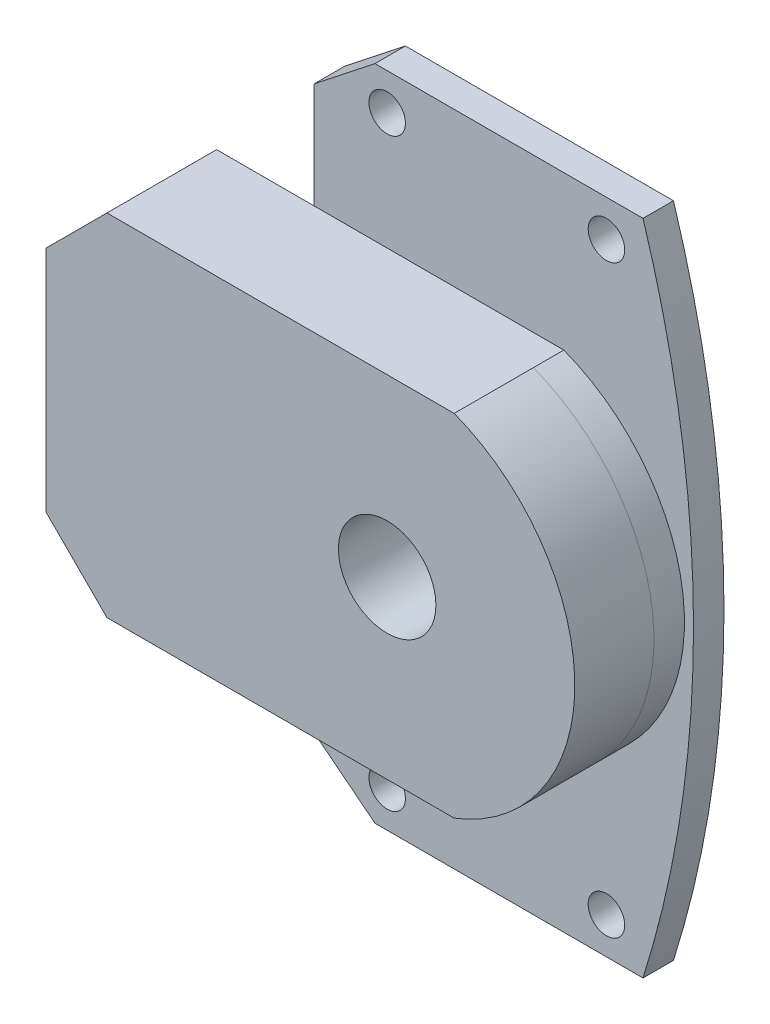
ISO-10303-21;
HEADER;
FILE_DESCRIPTION(('STEP AP214'),'2;1');
FILE_NAME('part.step','',(''),(''),'','','');
FILE_SCHEMA(('AUTOMOTIVE_DESIGN { 1 0 10303 214 1 1 1 1 }'));
ENDSEC;
DATA;
#1=APPLICATION_CONTEXT('core data for automotive mechanical design processes');
#2=APPLICATION_PROTOCOL_DEFINITION('international standard','automotive_design',2000,#1);
#3=PRODUCT_CONTEXT('',#1,'mechanical');
#4=PRODUCT('Part','Part','',(#3));
#5=PRODUCT_RELATED_PRODUCT_CATEGORY('part','',(#4));
#6=PRODUCT_DEFINITION_FORMATION('','',#4);
#7=PRODUCT_DEFINITION_CONTEXT('part definition',#1,'design');
#8=PRODUCT_DEFINITION('design','',#6,#7);
#9=PRODUCT_DEFINITION_SHAPE('','',#8);
#10=(LENGTH_UNIT() NAMED_UNIT(*) SI_UNIT(.MILLI.,.METRE.));
#11=(NAMED_UNIT(*) PLANE_ANGLE_UNIT() SI_UNIT($,.RADIAN.));
#12=(NAMED_UNIT(*) SI_UNIT($,.STERADIAN.) SOLID_ANGLE_UNIT());
#13=UNCERTAINTY_MEASURE_WITH_UNIT(LENGTH_MEASURE(1.E-05),#10,'distance_accuracy_value','');
#14=(GEOMETRIC_REPRESENTATION_CONTEXT(3) GLOBAL_UNCERTAINTY_ASSIGNED_CONTEXT((#13)) GLOBAL_UNIT_ASSIGNED_CONTEXT((#10,
#11,#12)) REPRESENTATION_CONTEXT('',''));
#15=CARTESIAN_POINT('',(0.,0.,0.));
#16=DIRECTION('',(0.,0.,1.));
#17=DIRECTION('',(1.,0.,0.));
#18=AXIS2_PLACEMENT_3D('',#15,#16,#17);
#19=CARTESIAN_POINT('',(-87.5169435511757,-10.5980462863294,-2.5));
#20=DIRECTION('',(0.,0.,-1.));
#21=DIRECTION('',(-1.,0.,0.));
#22=AXIS2_PLACEMENT_3D('',#19,#20,#21);
#23=PLANE('',#22);
#24=CARTESIAN_POINT('',(-4.66241542365062,-34.5980462863294,-2.5));
#25=DIRECTION('',(0.,0.,-1.));
#26=DIRECTION('',(1.,0.,0.));
#27=AXIS2_PLACEMENT_3D('',#24,#25,#26);
#28=CIRCLE('',#27,1.5);
#29=CARTESIAN_POINT('',(-3.16241542365062,-34.5980462863294,-2.5));
#30=VERTEX_POINT('',#29);
#31=EDGE_CURVE('E224',#30,#30,#28,.T.);
#32=ORIENTED_EDGE('',*,*,#31,.F.);
#33=EDGE_LOOP('',(#32));
#34=FACE_BOUND('',#33,.T.);
#35=CARTESIAN_POINT('',(-4.66241542365062,13.4019537136706,-2.5));
#36=DIRECTION('',(0.,0.,-1.));
#37=DIRECTION('',(-1.,0.,0.));
#38=AXIS2_PLACEMENT_3D('',#35,#36,#37);
#39=CIRCLE('',#38,1.5);
#40=CARTESIAN_POINT('',(-6.16241542365062,13.4019537136706,-2.5));
#41=VERTEX_POINT('',#40);
#42=EDGE_CURVE('E163',#41,#41,#39,.T.);
#43=ORIENTED_EDGE('',*,*,#42,.F.);
#44=EDGE_LOOP('',(#43));
#45=FACE_BOUND('',#44,.T.);
#46=DIRECTION('',(-0.785278343538107,0.619142893983325,0.));
#47=VECTOR('',#46,1.);
#48=CARTESIAN_POINT('',(-28.6624154236506,-33.6558587863294,-2.5));
#49=LINE('',#48,#47);
#50=CARTESIAN_POINT('',(-23.6624154236506,-37.5980462863294,-2.5));
#51=VERTEX_POINT('',#50);
#52=CARTESIAN_POINT('',(-28.6624154236506,-33.6558587863294,-2.5));
#53=VERTEX_POINT('',#52);
#54=EDGE_CURVE('E164',#51,#53,#49,.T.);
#55=ORIENTED_EDGE('',*,*,#54,.T.);
#56=DIRECTION('',(0.,1.,0.));
#57=VECTOR('',#56,1.);
#58=CARTESIAN_POINT('',(-28.6624154236506,12.4597662136706,-2.5));
#59=LINE('',#58,#57);
#60=CARTESIAN_POINT('',(-28.6624154236506,12.4597662136706,-2.5));
#61=VERTEX_POINT('',#60);
#62=EDGE_CURVE('E107',#53,#61,#59,.T.);
#63=ORIENTED_EDGE('',*,*,#62,.T.);
#64=DIRECTION('',(0.785278343538107,0.619142893983325,0.));
#65=VECTOR('',#64,1.);
#66=CARTESIAN_POINT('',(-23.6624154236506,16.4019537136706,-2.5));
#67=LINE('',#66,#65);
#68=CARTESIAN_POINT('',(-23.6624154236506,16.4019537136706,-2.5));
#69=VERTEX_POINT('',#68);
#70=EDGE_CURVE('E120',#61,#69,#67,.T.);
#71=ORIENTED_EDGE('',*,*,#70,.T.);
#72=DIRECTION('',(1.,0.,0.));
#73=VECTOR('',#72,1.);
#74=CARTESIAN_POINT('',(-23.6624154236506,16.4019537136706,-2.5));
#75=LINE('',#74,#73);
#76=CARTESIAN_POINT('',(-1.66241542365062,16.4019537136706,-2.5));
#77=VERTEX_POINT('',#76);
#78=EDGE_CURVE('E114',#69,#77,#75,.T.);
#79=ORIENTED_EDGE('',*,*,#78,.T.);
#80=CARTESIAN_POINT('',(-87.5169435511757,-10.5980462863294,-2.5));
#81=DIRECTION('',(0.,0.,-1.));
#82=DIRECTION('',(-1.,0.,0.));
#83=AXIS2_PLACEMENT_3D('',#80,#81,#82);
#84=CIRCLE('',#83,90.);
#85=CARTESIAN_POINT('',(-1.66241542365062,-37.5980462863294,-2.5));
#86=VERTEX_POINT('',#85);
#87=EDGE_CURVE('E118',#77,#86,#84,.T.);
#88=ORIENTED_EDGE('',*,*,#87,.T.);
#89=DIRECTION('',(-1.,0.,0.));
#90=VECTOR('',#89,1.);
#91=CARTESIAN_POINT('',(-23.6624154236506,-37.5980462863294,-2.5));
#92=LINE('',#91,#90);
#93=EDGE_CURVE('E70',#86,#51,#92,.T.);
#94=ORIENTED_EDGE('',*,*,#93,.T.);
#95=EDGE_LOOP('',(#55,#63,#71,#79,#88,#94));
#96=FACE_BOUND('',#95,.T.);
#97=CARTESIAN_POINT('',(-13.6624154236506,-10.5980462863294,-2.5));
#98=DIRECTION('',(0.,0.,-1.));
#99=DIRECTION('',(-1.,0.,0.));
#100=AXIS2_PLACEMENT_3D('',#97,#98,#99);
#101=CIRCLE('',#100,10.);
#102=CARTESIAN_POINT('',(-23.6624154236506,-10.5980462863294,-2.5));
#103=VERTEX_POINT('',#102);
#104=EDGE_CURVE('E151',#103,#103,#101,.T.);
#105=ORIENTED_EDGE('',*,*,#104,.F.);
#106=EDGE_LOOP('',(#105));
#107=FACE_BOUND('',#106,.T.);
#108=CARTESIAN_POINT('',(-22.6624154236506,13.4019537136706,-2.5));
#109=DIRECTION('',(0.,0.,-1.));
#110=DIRECTION('',(1.,0.,0.));
#111=AXIS2_PLACEMENT_3D('',#108,#109,#110);
#112=CIRCLE('',#111,1.5);
#113=CARTESIAN_POINT('',(-21.1624154236506,13.4019537136706,-2.5));
#114=VERTEX_POINT('',#113);
#115=EDGE_CURVE('E229',#114,#114,#112,.T.);
#116=ORIENTED_EDGE('',*,*,#115,.F.);
#117=EDGE_LOOP('',(#116));
#118=FACE_BOUND('',#117,.T.);
#119=CARTESIAN_POINT('',(-22.6624154236506,-34.5980462863294,-2.5));
#120=DIRECTION('',(0.,0.,-1.));
#121=DIRECTION('',(-1.,0.,0.));
#122=AXIS2_PLACEMENT_3D('',#119,#120,#121);
#123=CIRCLE('',#122,1.5);
#124=CARTESIAN_POINT('',(-24.1624154236506,-34.5980462863294,-2.5));
#125=VERTEX_POINT('',#124);
#126=EDGE_CURVE('E218',#125,#125,#123,.T.);
#127=ORIENTED_EDGE('',*,*,#126,.F.);
#128=EDGE_LOOP('',(#127));
#129=FACE_BOUND('',#128,.T.);
#130=ADVANCED_FACE('F53',(#34,#45,#96,#107,#118,#129),#23,.T.);
#131=CARTESIAN_POINT('',(-87.5169435511757,-10.5980462863294,0.));
#132=DIRECTION('',(0.,0.,-1.));
#133=DIRECTION('',(-1.,0.,0.));
#134=AXIS2_PLACEMENT_3D('',#131,#132,#133);
#135=PLANE('',#134);
#136=DIRECTION('',(-0.785278343538107,0.619142893983325,0.));
#137=VECTOR('',#136,1.);
#138=CARTESIAN_POINT('',(-28.6624154236506,-33.6558587863294,0.));
#139=LINE('',#138,#137);
#140=CARTESIAN_POINT('',(-23.6624154236506,-37.5980462863294,0.));
#141=VERTEX_POINT('',#140);
#142=CARTESIAN_POINT('',(-28.6624154236506,-33.6558587863294,0.));
#143=VERTEX_POINT('',#142);
#144=EDGE_CURVE('E157',#141,#143,#139,.T.);
#145=ORIENTED_EDGE('',*,*,#144,.F.);
#146=DIRECTION('',(-1.,0.,0.));
#147=VECTOR('',#146,1.);
#148=CARTESIAN_POINT('',(-23.6624154236506,-37.5980462863294,0.));
#149=LINE('',#148,#147);
#150=CARTESIAN_POINT('',(-1.66241542365062,-37.5980462863294,0.));
#151=VERTEX_POINT('',#150);
#152=EDGE_CURVE('E99',#151,#141,#149,.T.);
#153=ORIENTED_EDGE('',*,*,#152,.F.);
#154=CARTESIAN_POINT('',(-87.5169435511757,-10.5980462863294,0.));
#155=DIRECTION('',(0.,0.,-1.));
#156=DIRECTION('',(-1.,0.,0.));
#157=AXIS2_PLACEMENT_3D('',#154,#155,#156);
#158=CIRCLE('',#157,90.);
#159=CARTESIAN_POINT('',(-1.66241542365062,16.4019537136706,0.));
#160=VERTEX_POINT('',#159);
#161=EDGE_CURVE('E93',#160,#151,#158,.T.);
#162=ORIENTED_EDGE('',*,*,#161,.F.);
#163=DIRECTION('',(1.,0.,0.));
#164=VECTOR('',#163,1.);
#165=CARTESIAN_POINT('',(-23.6624154236506,16.4019537136706,0.));
#166=LINE('',#165,#164);
#167=CARTESIAN_POINT('',(-23.6624154236506,16.4019537136706,0.));
#168=VERTEX_POINT('',#167);
#169=EDGE_CURVE('E129',#168,#160,#166,.T.);
#170=ORIENTED_EDGE('',*,*,#169,.F.);
#171=DIRECTION('',(0.785278343538107,0.619142893983325,0.));
#172=VECTOR('',#171,1.);
#173=CARTESIAN_POINT('',(-23.6624154236506,16.4019537136706,0.));
#174=LINE('',#173,#172);
#175=CARTESIAN_POINT('',(-28.6624154236506,12.4597662136706,0.));
#176=VERTEX_POINT('',#175);
#177=EDGE_CURVE('E184',#176,#168,#174,.T.);
#178=ORIENTED_EDGE('',*,*,#177,.F.);
#179=DIRECTION('',(0.,1.,0.));
#180=VECTOR('',#179,1.);
#181=CARTESIAN_POINT('',(-28.6624154236506,12.4597662136706,0.));
#182=LINE('',#181,#180);
#183=EDGE_CURVE('E180',#143,#176,#182,.T.);
#184=ORIENTED_EDGE('',*,*,#183,.F.);
#185=EDGE_LOOP('',(#145,#153,#162,#170,#178,#184));
#186=FACE_BOUND('',#185,.T.);
#187=CARTESIAN_POINT('',(-13.6624154236506,-10.5980462863294,0.));
#188=DIRECTION('',(0.,0.,-1.));
#189=DIRECTION('',(-1.,0.,0.));
#190=AXIS2_PLACEMENT_3D('',#187,#188,#189);
#191=CIRCLE('',#190,10.);
#192=CARTESIAN_POINT('',(-23.6624154236506,-10.5980462863294,0.));
#193=VERTEX_POINT('',#192);
#194=EDGE_CURVE('E158',#193,#193,#191,.T.);
#195=ORIENTED_EDGE('',*,*,#194,.T.);
#196=EDGE_LOOP('',(#195));
#197=FACE_BOUND('',#196,.T.);
#198=CARTESIAN_POINT('',(-4.66241542365062,13.4019537136706,0.));
#199=DIRECTION('',(0.,0.,-1.));
#200=DIRECTION('',(-1.,0.,0.));
#201=AXIS2_PLACEMENT_3D('',#198,#199,#200);
#202=CIRCLE('',#201,1.5);
#203=CARTESIAN_POINT('',(-6.16241542365062,13.4019537136706,0.));
#204=VERTEX_POINT('',#203);
#205=EDGE_CURVE('E159',#204,#204,#202,.T.);
#206=ORIENTED_EDGE('',*,*,#205,.T.);
#207=EDGE_LOOP('',(#206));
#208=FACE_BOUND('',#207,.T.);
#209=CARTESIAN_POINT('',(-22.6624154236506,13.4019537136706,0.));
#210=DIRECTION('',(0.,0.,-1.));
#211=DIRECTION('',(1.,0.,0.));
#212=AXIS2_PLACEMENT_3D('',#209,#210,#211);
#213=CIRCLE('',#212,1.5);
#214=CARTESIAN_POINT('',(-21.1624154236506,13.4019537136706,0.));
#215=VERTEX_POINT('',#214);
#216=EDGE_CURVE('E209',#215,#215,#213,.T.);
#217=ORIENTED_EDGE('',*,*,#216,.T.);
#218=EDGE_LOOP('',(#217));
#219=FACE_BOUND('',#218,.T.);
#220=CARTESIAN_POINT('',(-4.66241542365062,-34.5980462863294,0.));
#221=DIRECTION('',(0.,0.,-1.));
#222=DIRECTION('',(1.,0.,0.));
#223=AXIS2_PLACEMENT_3D('',#220,#221,#222);
#224=CIRCLE('',#223,1.5);
#225=CARTESIAN_POINT('',(-3.16241542365062,-34.5980462863294,0.));
#226=VERTEX_POINT('',#225);
#227=EDGE_CURVE('E213',#226,#226,#224,.T.);
#228=ORIENTED_EDGE('',*,*,#227,.T.);
#229=EDGE_LOOP('',(#228));
#230=FACE_BOUND('',#229,.T.);
#231=CARTESIAN_POINT('',(-22.6624154236506,-34.5980462863294,0.));
#232=DIRECTION('',(0.,0.,-1.));
#233=DIRECTION('',(-1.,0.,0.));
#234=AXIS2_PLACEMENT_3D('',#231,#232,#233);
#235=CIRCLE('',#234,1.5);
#236=CARTESIAN_POINT('',(-24.1624154236506,-34.5980462863294,0.));
#237=VERTEX_POINT('',#236);
#238=EDGE_CURVE('E216',#237,#237,#235,.T.);
#239=ORIENTED_EDGE('',*,*,#238,.T.);
#240=EDGE_LOOP('',(#239));
#241=FACE_BOUND('',#240,.T.);
#242=ADVANCED_FACE('F197',(#186,#197,#208,#219,#230,#241),#135,.F.);
#243=CARTESIAN_POINT('',(-28.6624154236506,-33.6558587863294,-2.5));
#244=DIRECTION('',(0.619142893983325,0.785278343538107,0.));
#245=DIRECTION('',(-0.785278343538107,0.619142893983326,0.));
#246=AXIS2_PLACEMENT_3D('',#243,#244,#245);
#247=PLANE('',#246);
#248=ORIENTED_EDGE('',*,*,#144,.T.);
#249=DIRECTION('',(0.,0.,1.));
#250=VECTOR('',#249,1.);
#251=CARTESIAN_POINT('',(-28.6624154236506,-33.6558587863294,-2.5));
#252=LINE('',#251,#250);
#253=EDGE_CURVE('E13',#53,#143,#252,.T.);
#254=ORIENTED_EDGE('',*,*,#253,.F.);
#255=ORIENTED_EDGE('',*,*,#54,.F.);
#256=DIRECTION('',(0.,0.,1.));
#257=VECTOR('',#256,1.);
#258=CARTESIAN_POINT('',(-23.6624154236506,-37.5980462863294,-2.5));
#259=LINE('',#258,#257);
#260=EDGE_CURVE('E137',#51,#141,#259,.T.);
#261=ORIENTED_EDGE('',*,*,#260,.T.);
#262=EDGE_LOOP('',(#248,#254,#255,#261));
#263=FACE_BOUND('',#262,.T.);
#264=ADVANCED_FACE('F55',(#263),#247,.F.);
#265=CARTESIAN_POINT('',(-28.6624154236506,12.4597662136706,-2.5));
#266=DIRECTION('',(1.,0.,0.));
#267=DIRECTION('',(0.,1.,0.));
#268=AXIS2_PLACEMENT_3D('',#265,#266,#267);
#269=PLANE('',#268);
#270=ORIENTED_EDGE('',*,*,#183,.T.);
#271=DIRECTION('',(0.,0.,1.));
#272=VECTOR('',#271,1.);
#273=CARTESIAN_POINT('',(-28.6624154236506,12.4597662136706,-2.5));
#274=LINE('',#273,#272);
#275=EDGE_CURVE('E62',#61,#176,#274,.T.);
#276=ORIENTED_EDGE('',*,*,#275,.F.);
#277=ORIENTED_EDGE('',*,*,#62,.F.);
#278=ORIENTED_EDGE('',*,*,#253,.T.);
#279=EDGE_LOOP('',(#270,#276,#277,#278));
#280=FACE_BOUND('',#279,.T.);
#281=ADVANCED_FACE('F179',(#280),#269,.F.);
#282=CARTESIAN_POINT('',(-23.6624154236506,16.4019537136706,-2.5));
#283=DIRECTION('',(0.619142893983325,-0.785278343538107,0.));
#284=DIRECTION('',(0.785278343538107,0.619142893983325,0.));
#285=AXIS2_PLACEMENT_3D('',#282,#283,#284);
#286=PLANE('',#285);
#287=ORIENTED_EDGE('',*,*,#177,.T.);
#288=DIRECTION('',(0.,0.,1.));
#289=VECTOR('',#288,1.);
#290=CARTESIAN_POINT('',(-23.6624154236506,16.4019537136706,-2.5));
#291=LINE('',#290,#289);
#292=EDGE_CURVE('E130',#69,#168,#291,.T.);
#293=ORIENTED_EDGE('',*,*,#292,.F.);
#294=ORIENTED_EDGE('',*,*,#70,.F.);
#295=ORIENTED_EDGE('',*,*,#275,.T.);
#296=EDGE_LOOP('',(#287,#293,#294,#295));
#297=FACE_BOUND('',#296,.T.);
#298=ADVANCED_FACE('F183',(#297),#286,.F.);
#299=CARTESIAN_POINT('',(-23.6624154236506,16.4019537136706,-2.5));
#300=DIRECTION('',(0.,-1.,0.));
#301=DIRECTION('',(1.,0.,0.));
#302=AXIS2_PLACEMENT_3D('',#299,#300,#301);
#303=PLANE('',#302);
#304=ORIENTED_EDGE('',*,*,#169,.T.);
#305=DIRECTION('',(0.,0.,1.));
#306=VECTOR('',#305,1.);
#307=CARTESIAN_POINT('',(-1.66241542365062,16.4019537136706,-2.5));
#308=LINE('',#307,#306);
#309=EDGE_CURVE('E126',#77,#160,#308,.T.);
#310=ORIENTED_EDGE('',*,*,#309,.F.);
#311=ORIENTED_EDGE('',*,*,#78,.F.);
#312=ORIENTED_EDGE('',*,*,#292,.T.);
#313=EDGE_LOOP('',(#304,#310,#311,#312));
#314=FACE_BOUND('',#313,.T.);
#315=ADVANCED_FACE('F127',(#314),#303,.F.);
#316=CARTESIAN_POINT('',(-87.5169435511757,-10.5980462863294,-2.5));
#317=DIRECTION('',(0.,0.,1.));
#318=DIRECTION('',(1.,0.,0.));
#319=AXIS2_PLACEMENT_3D('',#316,#317,#318);
#320=CYLINDRICAL_SURFACE('',#319,90.);
#321=ORIENTED_EDGE('',*,*,#161,.T.);
#322=DIRECTION('',(0.,0.,1.));
#323=VECTOR('',#322,1.);
#324=CARTESIAN_POINT('',(-1.66241542365062,-37.5980462863294,-2.5));
#325=LINE('',#324,#323);
#326=EDGE_CURVE('E131',#86,#151,#325,.T.);
#327=ORIENTED_EDGE('',*,*,#326,.F.);
#328=ORIENTED_EDGE('',*,*,#87,.F.);
#329=ORIENTED_EDGE('',*,*,#309,.T.);
#330=EDGE_LOOP('',(#321,#327,#328,#329));
#331=FACE_BOUND('',#330,.T.);
#332=ADVANCED_FACE('F133',(#331),#320,.T.);
#333=CARTESIAN_POINT('',(-23.6624154236506,-37.5980462863294,-2.5));
#334=DIRECTION('',(0.,1.,0.));
#335=DIRECTION('',(-1.,0.,0.));
#336=AXIS2_PLACEMENT_3D('',#333,#334,#335);
#337=PLANE('',#336);
#338=ORIENTED_EDGE('',*,*,#152,.T.);
#339=ORIENTED_EDGE('',*,*,#260,.F.);
#340=ORIENTED_EDGE('',*,*,#93,.F.);
#341=ORIENTED_EDGE('',*,*,#326,.T.);
#342=EDGE_LOOP('',(#338,#339,#340,#341));
#343=FACE_BOUND('',#342,.T.);
#344=ADVANCED_FACE('F252',(#343),#337,.F.);
#345=CARTESIAN_POINT('',(-13.6624154236506,-10.5980462863294,-2.5));
#346=DIRECTION('',(0.,0.,1.));
#347=DIRECTION('',(1.,0.,0.));
#348=AXIS2_PLACEMENT_3D('',#345,#346,#347);
#349=CYLINDRICAL_SURFACE('',#348,10.);
#350=ORIENTED_EDGE('',*,*,#104,.T.);
#351=EDGE_LOOP('',(#350));
#352=FACE_BOUND('',#351,.T.);
#353=ORIENTED_EDGE('',*,*,#194,.F.);
#354=EDGE_LOOP('',(#353));
#355=FACE_BOUND('',#354,.T.);
#356=ADVANCED_FACE('F249',(#352,#355),#349,.F.);
#357=CARTESIAN_POINT('',(-4.66241542365062,13.4019537136706,-2.5));
#358=DIRECTION('',(0.,0.,1.));
#359=DIRECTION('',(1.,0.,0.));
#360=AXIS2_PLACEMENT_3D('',#357,#358,#359);
#361=CYLINDRICAL_SURFACE('',#360,1.5);
#362=ORIENTED_EDGE('',*,*,#42,.T.);
#363=EDGE_LOOP('',(#362));
#364=FACE_BOUND('',#363,.T.);
#365=ORIENTED_EDGE('',*,*,#205,.F.);
#366=EDGE_LOOP('',(#365));
#367=FACE_BOUND('',#366,.T.);
#368=ADVANCED_FACE('F239',(#364,#367),#361,.F.);
#369=CARTESIAN_POINT('',(-22.6624154236506,13.4019537136706,-2.5));
#370=DIRECTION('',(0.,0.,1.));
#371=DIRECTION('',(1.,0.,0.));
#372=AXIS2_PLACEMENT_3D('',#369,#370,#371);
#373=CYLINDRICAL_SURFACE('',#372,1.5);
#374=ORIENTED_EDGE('',*,*,#115,.T.);
#375=EDGE_LOOP('',(#374));
#376=FACE_BOUND('',#375,.T.);
#377=ORIENTED_EDGE('',*,*,#216,.F.);
#378=EDGE_LOOP('',(#377));
#379=FACE_BOUND('',#378,.T.);
#380=ADVANCED_FACE('F317',(#376,#379),#373,.F.);
#381=CARTESIAN_POINT('',(-4.66241542365062,-34.5980462863294,-2.5));
#382=DIRECTION('',(0.,0.,1.));
#383=DIRECTION('',(1.,0.,0.));
#384=AXIS2_PLACEMENT_3D('',#381,#382,#383);
#385=CYLINDRICAL_SURFACE('',#384,1.5);
#386=ORIENTED_EDGE('',*,*,#31,.T.);
#387=EDGE_LOOP('',(#386));
#388=FACE_BOUND('',#387,.T.);
#389=ORIENTED_EDGE('',*,*,#227,.F.);
#390=EDGE_LOOP('',(#389));
#391=FACE_BOUND('',#390,.T.);
#392=ADVANCED_FACE('F324',(#388,#391),#385,.F.);
#393=CARTESIAN_POINT('',(-22.6624154236506,-34.5980462863294,-2.5));
#394=DIRECTION('',(0.,0.,1.));
#395=DIRECTION('',(1.,0.,0.));
#396=AXIS2_PLACEMENT_3D('',#393,#394,#395);
#397=CYLINDRICAL_SURFACE('',#396,1.5);
#398=ORIENTED_EDGE('',*,*,#126,.T.);
#399=EDGE_LOOP('',(#398));
#400=FACE_BOUND('',#399,.T.);
#401=ORIENTED_EDGE('',*,*,#238,.F.);
#402=EDGE_LOOP('',(#401));
#403=FACE_BOUND('',#402,.T.);
#404=ADVANCED_FACE('F333',(#400,#403),#397,.F.);
#405=CLOSED_SHELL('',(#130,#242,#264,#281,#298,#315,#332,#344,#356,#368,#380,#392,#404));
#406=MANIFOLD_SOLID_BREP('B2',#405);
#407=CARTESIAN_POINT('',(-13.6624154236506,-10.5980462863294,1.74455679792347E-13));
#408=DIRECTION('',(0.,0.,1.));
#409=DIRECTION('',(1.,0.,0.));
#410=AXIS2_PLACEMENT_3D('',#407,#408,#409);
#411=PLANE('',#410);
#412=DIRECTION('',(-0.707106781186547,-0.707106781186548,0.));
#413=VECTOR('',#412,1.);
#414=CARTESIAN_POINT('',(-36.6624154236506,3.78695371367061,1.74455679792347E-13));
#415=LINE('',#414,#413);
#416=CARTESIAN_POINT('',(-36.6624154236506,3.78695371367061,1.74455679792347E-13));
#417=VERTEX_POINT('',#416);
#418=CARTESIAN_POINT('',(-41.6624154236506,-1.21304628632939,1.74455679792347E-13));
#419=VERTEX_POINT('',#418);
#420=EDGE_CURVE('E423',#417,#419,#415,.T.);
#421=ORIENTED_EDGE('',*,*,#420,.F.);
#422=DIRECTION('',(-1.,0.,0.));
#423=VECTOR('',#422,1.);
#424=CARTESIAN_POINT('',(-19.1624154236506,3.78695371367061,1.74455679792347E-13));
#425=LINE('',#424,#423);
#426=CARTESIAN_POINT('',(-8.16241542365062,3.78695371367061,1.74455679792347E-13));
#427=VERTEX_POINT('',#426);
#428=EDGE_CURVE('E407',#427,#417,#425,.T.);
#429=ORIENTED_EDGE('',*,*,#428,.F.);
#430=CARTESIAN_POINT('',(-13.6624154236506,-10.5980462863294,1.74455679792347E-13));
#431=DIRECTION('',(0.,0.,1.));
#432=DIRECTION('',(1.,0.,0.));
#433=AXIS2_PLACEMENT_3D('',#430,#431,#432);
#434=CIRCLE('',#433,15.4005917094117);
#435=CARTESIAN_POINT('',(-8.16241542365062,-24.9830462863294,1.74455679792347E-13));
#436=VERTEX_POINT('',#435);
#437=EDGE_CURVE('E417',#436,#427,#434,.T.);
#438=ORIENTED_EDGE('',*,*,#437,.F.);
#439=DIRECTION('',(1.,0.,0.));
#440=VECTOR('',#439,1.);
#441=CARTESIAN_POINT('',(-19.1624154236506,-24.9830462863294,1.74455679792347E-13));
#442=LINE('',#441,#440);
#443=CARTESIAN_POINT('',(-36.6624154236506,-24.9830462863294,1.74455679792347E-13));
#444=VERTEX_POINT('',#443);
#445=EDGE_CURVE('E441',#444,#436,#442,.T.);
#446=ORIENTED_EDGE('',*,*,#445,.F.);
#447=DIRECTION('',(0.707106781186548,-0.707106781186547,0.));
#448=VECTOR('',#447,1.);
#449=CARTESIAN_POINT('',(-41.6624154236506,-19.9830462863294,1.74455679792347E-13));
#450=LINE('',#449,#448);
#451=CARTESIAN_POINT('',(-41.6624154236506,-19.9830462863294,1.74455679792347E-13));
#452=VERTEX_POINT('',#451);
#453=EDGE_CURVE('E432',#452,#444,#450,.T.);
#454=ORIENTED_EDGE('',*,*,#453,.F.);
#455=DIRECTION('',(0.,-1.,0.));
#456=VECTOR('',#455,1.);
#457=CARTESIAN_POINT('',(-41.6624154236506,-1.21304628632939,1.74455679792347E-13));
#458=LINE('',#457,#456);
#459=EDGE_CURVE('E429',#419,#452,#458,.T.);
#460=ORIENTED_EDGE('',*,*,#459,.F.);
#461=EDGE_LOOP('',(#421,#429,#438,#446,#454,#460));
#462=FACE_BOUND('',#461,.T.);
#463=CARTESIAN_POINT('',(-29.4124154236506,-21.0780462863294,1.74455679792347E-13));
#464=DIRECTION('',(0.,0.,1.));
#465=DIRECTION('',(1.,0.,0.));
#466=AXIS2_PLACEMENT_3D('',#463,#464,#465);
#467=CIRCLE('',#466,1.98);
#468=CARTESIAN_POINT('',(-27.4324154236506,-21.0780462863294,1.74455679792347E-13));
#469=VERTEX_POINT('',#468);
#470=EDGE_CURVE('E430',#469,#469,#467,.T.);
#471=ORIENTED_EDGE('',*,*,#470,.T.);
#472=EDGE_LOOP('',(#471));
#473=FACE_BOUND('',#472,.T.);
#474=CARTESIAN_POINT('',(-29.4124154236506,-0.118046286329387,1.74455679792347E-13));
#475=DIRECTION('',(0.,0.,1.));
#476=DIRECTION('',(1.,0.,0.));
#477=AXIS2_PLACEMENT_3D('',#474,#475,#476);
#478=CIRCLE('',#477,1.98);
#479=CARTESIAN_POINT('',(-27.4324154236506,-0.118046286329387,1.74455679792347E-13));
#480=VERTEX_POINT('',#479);
#481=EDGE_CURVE('E435',#480,#480,#478,.T.);
#482=ORIENTED_EDGE('',*,*,#481,.T.);
#483=EDGE_LOOP('',(#482));
#484=FACE_BOUND('',#483,.T.);
#485=CARTESIAN_POINT('',(-13.6624154236506,-10.5980462863294,1.74455679792347E-13));
#486=DIRECTION('',(0.,0.,1.));
#487=DIRECTION('',(1.,0.,0.));
#488=AXIS2_PLACEMENT_3D('',#485,#486,#487);
#489=CIRCLE('',#488,6.3);
#490=CARTESIAN_POINT('',(-7.36241542365062,-10.5980462863294,1.74455679792347E-13));
#491=VERTEX_POINT('',#490);
#492=EDGE_CURVE('E616',#491,#491,#489,.T.);
#493=ORIENTED_EDGE('',*,*,#492,.T.);
#494=EDGE_LOOP('',(#493));
#495=FACE_BOUND('',#494,.T.);
#496=CARTESIAN_POINT('',(-13.6624154236506,-1.07304628632939,1.74455679792347E-13));
#497=DIRECTION('',(0.,0.,1.));
#498=DIRECTION('',(1.,0.,0.));
#499=AXIS2_PLACEMENT_3D('',#496,#497,#498);
#500=CIRCLE('',#499,1.475);
#501=CARTESIAN_POINT('',(-12.1874154236506,-1.07304628632939,1.74455679792347E-13));
#502=VERTEX_POINT('',#501);
#503=EDGE_CURVE('E613',#502,#502,#500,.T.);
#504=ORIENTED_EDGE('',*,*,#503,.T.);
#505=EDGE_LOOP('',(#504));
#506=FACE_BOUND('',#505,.T.);
#507=CARTESIAN_POINT('',(-13.6624154236506,-20.1230462863294,1.74455679792347E-13));
#508=DIRECTION('',(0.,0.,1.));
#509=DIRECTION('',(1.,0.,0.));
#510=AXIS2_PLACEMENT_3D('',#507,#508,#509);
#511=CIRCLE('',#510,1.475);
#512=CARTESIAN_POINT('',(-12.1874154236506,-20.1230462863294,1.74455679792347E-13));
#513=VERTEX_POINT('',#512);
#514=EDGE_CURVE('E610',#513,#513,#511,.T.);
#515=ORIENTED_EDGE('',*,*,#514,.T.);
#516=EDGE_LOOP('',(#515));
#517=FACE_BOUND('',#516,.T.);
#518=CARTESIAN_POINT('',(-4.6821593025815,-19.5783024073986,1.74455679792347E-13));
#519=DIRECTION('',(0.,0.,1.));
#520=DIRECTION('',(1.,0.,0.));
#521=AXIS2_PLACEMENT_3D('',#518,#519,#520);
#522=CIRCLE('',#521,1.05);
#523=CARTESIAN_POINT('',(-3.6321593025815,-19.5783024073986,1.74455679792347E-13));
#524=VERTEX_POINT('',#523);
#525=EDGE_CURVE('E607',#524,#524,#522,.T.);
#526=ORIENTED_EDGE('',*,*,#525,.T.);
#527=EDGE_LOOP('',(#526));
#528=FACE_BOUND('',#527,.T.);
#529=CARTESIAN_POINT('',(-4.6821593025815,-1.61779016526022,1.74455679792347E-13));
#530=DIRECTION('',(0.,0.,1.));
#531=DIRECTION('',(1.,0.,0.));
#532=AXIS2_PLACEMENT_3D('',#529,#530,#531);
#533=CIRCLE('',#532,1.05);
#534=CARTESIAN_POINT('',(-3.6321593025815,-1.61779016526022,1.74455679792347E-13));
#535=VERTEX_POINT('',#534);
#536=EDGE_CURVE('E604',#535,#535,#533,.T.);
#537=ORIENTED_EDGE('',*,*,#536,.T.);
#538=EDGE_LOOP('',(#537));
#539=FACE_BOUND('',#538,.T.);
#540=CARTESIAN_POINT('',(-22.6426715447198,-1.61779016526022,1.74455679792347E-13));
#541=DIRECTION('',(0.,0.,1.));
#542=DIRECTION('',(1.,0.,0.));
#543=AXIS2_PLACEMENT_3D('',#540,#541,#542);
#544=CIRCLE('',#543,1.05);
#545=CARTESIAN_POINT('',(-21.5926715447198,-1.61779016526022,1.74455679792347E-13));
#546=VERTEX_POINT('',#545);
#547=EDGE_CURVE('E601',#546,#546,#544,.T.);
#548=ORIENTED_EDGE('',*,*,#547,.T.);
#549=EDGE_LOOP('',(#548));
#550=FACE_BOUND('',#549,.T.);
#551=CARTESIAN_POINT('',(-22.6426715447198,-19.5783024073986,1.74455679792347E-13));
#552=DIRECTION('',(0.,0.,1.));
#553=DIRECTION('',(1.,0.,0.));
#554=AXIS2_PLACEMENT_3D('',#551,#552,#553);
#555=CIRCLE('',#554,1.05);
#556=CARTESIAN_POINT('',(-21.5926715447198,-19.5783024073986,1.74455679792347E-13));
#557=VERTEX_POINT('',#556);
#558=EDGE_CURVE('E598',#557,#557,#555,.T.);
#559=ORIENTED_EDGE('',*,*,#558,.T.);
#560=EDGE_LOOP('',(#559));
#561=FACE_BOUND('',#560,.T.);
#562=CARTESIAN_POINT('',(-17.6624154236506,-3.66984305605386,1.74455679792347E-13));
#563=DIRECTION('',(0.,0.,1.));
#564=DIRECTION('',(1.,0.,0.));
#565=AXIS2_PLACEMENT_3D('',#562,#563,#564);
#566=CIRCLE('',#565,0.85);
#567=CARTESIAN_POINT('',(-16.8124154236506,-3.66984305605386,1.74455679792347E-13));
#568=VERTEX_POINT('',#567);
#569=EDGE_CURVE('E595',#568,#568,#566,.T.);
#570=ORIENTED_EDGE('',*,*,#569,.T.);
#571=EDGE_LOOP('',(#570));
#572=FACE_BOUND('',#571,.T.);
#573=CARTESIAN_POINT('',(-9.66241542365067,-17.5262495166049,1.74455679792347E-13));
#574=DIRECTION('',(0.,0.,1.));
#575=DIRECTION('',(1.,0.,0.));
#576=AXIS2_PLACEMENT_3D('',#573,#574,#575);
#577=CIRCLE('',#576,0.85);
#578=CARTESIAN_POINT('',(-8.81241542365067,-17.5262495166049,1.74455679792347E-13));
#579=VERTEX_POINT('',#578);
#580=EDGE_CURVE('E592',#579,#579,#577,.T.);
#581=ORIENTED_EDGE('',*,*,#580,.T.);
#582=EDGE_LOOP('',(#581));
#583=FACE_BOUND('',#582,.T.);
#584=ADVANCED_FACE('F364',(#462,#473,#484,#495,#506,#517,#528,#539,#550,#561,#572,#583),#411,.F.);
#585=CARTESIAN_POINT('',(-36.6624154236506,3.78695371367061,2.50000000000017));
#586=DIRECTION('',(0.707106781186548,-0.707106781186547,0.));
#587=DIRECTION('',(0.707106781186547,0.707106781186548,0.));
#588=AXIS2_PLACEMENT_3D('',#585,#586,#587);
#589=PLANE('',#588);
#590=ORIENTED_EDGE('',*,*,#420,.T.);
#591=DIRECTION('',(0.,0.,-1.));
#592=VECTOR('',#591,1.);
#593=CARTESIAN_POINT('',(-41.6624154236506,-1.21304628632939,2.50000000000017));
#594=LINE('',#593,#592);
#595=CARTESIAN_POINT('',(-41.6624154236506,-1.21304628632939,9.00000000000017));
#596=VERTEX_POINT('',#595);
#597=EDGE_CURVE('E51',#596,#419,#594,.T.);
#598=ORIENTED_EDGE('',*,*,#597,.F.);
#599=DIRECTION('',(-0.707106781186547,-0.707106781186548,0.));
#600=VECTOR('',#599,1.);
#601=CARTESIAN_POINT('',(-36.6624154236506,3.78695371367061,9.00000000000017));
#602=LINE('',#601,#600);
#603=CARTESIAN_POINT('',(-36.6624154236506,3.78695371367061,9.00000000000017));
#604=VERTEX_POINT('',#603);
#605=EDGE_CURVE('E425',#604,#596,#602,.T.);
#606=ORIENTED_EDGE('',*,*,#605,.F.);
#607=DIRECTION('',(0.,0.,-1.));
#608=VECTOR('',#607,1.);
#609=CARTESIAN_POINT('',(-36.6624154236506,3.78695371367061,2.50000000000017));
#610=LINE('',#609,#608);
#611=EDGE_CURVE('E413',#604,#417,#610,.T.);
#612=ORIENTED_EDGE('',*,*,#611,.T.);
#613=EDGE_LOOP('',(#590,#598,#606,#612));
#614=FACE_BOUND('',#613,.T.);
#615=ADVANCED_FACE('F366',(#614),#589,.F.);
#616=CARTESIAN_POINT('',(-41.6624154236506,-1.21304628632939,2.50000000000017));
#617=DIRECTION('',(1.,0.,0.));
#618=DIRECTION('',(0.,1.,0.));
#619=AXIS2_PLACEMENT_3D('',#616,#617,#618);
#620=PLANE('',#619);
#621=ORIENTED_EDGE('',*,*,#459,.T.);
#622=DIRECTION('',(0.,0.,-1.));
#623=VECTOR('',#622,1.);
#624=CARTESIAN_POINT('',(-41.6624154236506,-19.9830462863294,2.50000000000017));
#625=LINE('',#624,#623);
#626=CARTESIAN_POINT('',(-41.6624154236506,-19.9830462863294,9.00000000000017));
#627=VERTEX_POINT('',#626);
#628=EDGE_CURVE('E374',#627,#452,#625,.T.);
#629=ORIENTED_EDGE('',*,*,#628,.F.);
#630=DIRECTION('',(0.,-1.,0.));
#631=VECTOR('',#630,1.);
#632=CARTESIAN_POINT('',(-41.6624154236506,-19.9830462863294,9.00000000000017));
#633=LINE('',#632,#631);
#634=EDGE_CURVE('E719',#596,#627,#633,.T.);
#635=ORIENTED_EDGE('',*,*,#634,.F.);
#636=ORIENTED_EDGE('',*,*,#597,.T.);
#637=EDGE_LOOP('',(#621,#629,#635,#636));
#638=FACE_BOUND('',#637,.T.);
#639=ADVANCED_FACE('F475',(#638),#620,.F.);
#640=CARTESIAN_POINT('',(-41.6624154236506,-19.9830462863294,2.50000000000017));
#641=DIRECTION('',(0.707106781186547,0.707106781186548,0.));
#642=DIRECTION('',(-0.707106781186548,0.707106781186547,0.));
#643=AXIS2_PLACEMENT_3D('',#640,#641,#642);
#644=PLANE('',#643);
#645=ORIENTED_EDGE('',*,*,#453,.T.);
#646=DIRECTION('',(0.,0.,-1.));
#647=VECTOR('',#646,1.);
#648=CARTESIAN_POINT('',(-36.6624154236506,-24.9830462863294,2.50000000000017));
#649=LINE('',#648,#647);
#650=CARTESIAN_POINT('',(-36.6624154236506,-24.9830462863294,9.00000000000017));
#651=VERTEX_POINT('',#650);
#652=EDGE_CURVE('E444',#651,#444,#649,.T.);
#653=ORIENTED_EDGE('',*,*,#652,.F.);
#654=DIRECTION('',(0.707106781186548,-0.707106781186547,0.));
#655=VECTOR('',#654,1.);
#656=CARTESIAN_POINT('',(-36.6624154236506,-24.9830462863294,9.00000000000017));
#657=LINE('',#656,#655);
#658=EDGE_CURVE('E726',#627,#651,#657,.T.);
#659=ORIENTED_EDGE('',*,*,#658,.F.);
#660=ORIENTED_EDGE('',*,*,#628,.T.);
#661=EDGE_LOOP('',(#645,#653,#659,#660));
#662=FACE_BOUND('',#661,.T.);
#663=ADVANCED_FACE('F472',(#662),#644,.F.);
#664=CARTESIAN_POINT('',(-19.1624154236506,-24.9830462863294,2.50000000000017));
#665=DIRECTION('',(0.,1.,0.));
#666=DIRECTION('',(0.,0.,1.));
#667=AXIS2_PLACEMENT_3D('',#664,#665,#666);
#668=PLANE('',#667);
#669=ORIENTED_EDGE('',*,*,#445,.T.);
#670=DIRECTION('',(0.,0.,-1.));
#671=VECTOR('',#670,1.);
#672=CARTESIAN_POINT('',(-8.16241542365062,-24.9830462863294,2.50000000000017));
#673=LINE('',#672,#671);
#674=CARTESIAN_POINT('',(-8.16241542365062,-24.9830462863294,2.50000000000017));
#675=VERTEX_POINT('',#674);
#676=EDGE_CURVE('E447',#675,#436,#673,.T.);
#677=ORIENTED_EDGE('',*,*,#676,.F.);
#678=DIRECTION('',(0.,0.,-1.));
#679=VECTOR('',#678,1.);
#680=CARTESIAN_POINT('',(-8.16241542365061,-24.9830462863294,9.00000000000017));
#681=LINE('',#680,#679);
#682=CARTESIAN_POINT('',(-8.16241542365061,-24.9830462863294,9.00000000000017));
#683=VERTEX_POINT('',#682);
#684=EDGE_CURVE('E545',#683,#675,#681,.T.);
#685=ORIENTED_EDGE('',*,*,#684,.F.);
#686=DIRECTION('',(1.,0.,0.));
#687=VECTOR('',#686,1.);
#688=CARTESIAN_POINT('',(-8.16241542365062,-24.9830462863294,9.00000000000017));
#689=LINE('',#688,#687);
#690=EDGE_CURVE('E729',#651,#683,#689,.T.);
#691=ORIENTED_EDGE('',*,*,#690,.F.);
#692=ORIENTED_EDGE('',*,*,#652,.T.);
#693=EDGE_LOOP('',(#669,#677,#685,#691,#692));
#694=FACE_BOUND('',#693,.T.);
#695=ADVANCED_FACE('F468',(#694),#668,.F.);
#696=CARTESIAN_POINT('',(-13.6624154236506,-10.5980462863294,2.50000000000017));
#697=DIRECTION('',(0.,0.,-1.));
#698=DIRECTION('',(-1.,0.,0.));
#699=AXIS2_PLACEMENT_3D('',#696,#697,#698);
#700=CYLINDRICAL_SURFACE('',#699,15.4005917094117);
#701=ORIENTED_EDGE('',*,*,#437,.T.);
#702=DIRECTION('',(0.,0.,-1.));
#703=VECTOR('',#702,1.);
#704=CARTESIAN_POINT('',(-8.16241542365062,3.78695371367061,2.50000000000017));
#705=LINE('',#704,#703);
#706=CARTESIAN_POINT('',(-8.16241542365062,3.78695371367061,2.50000000000017));
#707=VERTEX_POINT('',#706);
#708=EDGE_CURVE('E383',#707,#427,#705,.T.);
#709=ORIENTED_EDGE('',*,*,#708,.F.);
#710=CARTESIAN_POINT('',(-13.6625687683024,-10.5980462863294,2.50000000000018));
#711=DIRECTION('',(0.,0.,1.));
#712=DIRECTION('',(0.357137822361272,-0.934051698697159,0.));
#713=AXIS2_PLACEMENT_3D('',#710,#711,#712);
#714=CIRCLE('',#713,15.4006464739206);
#715=EDGE_CURVE('E416',#675,#707,#714,.T.);
#716=ORIENTED_EDGE('',*,*,#715,.F.);
#717=ORIENTED_EDGE('',*,*,#676,.T.);
#718=EDGE_LOOP('',(#701,#709,#716,#717));
#719=FACE_BOUND('',#718,.T.);
#720=ADVANCED_FACE('F458',(#719),#700,.T.);
#721=CARTESIAN_POINT('',(-19.1624154236506,3.78695371367061,2.50000000000017));
#722=DIRECTION('',(0.,-1.,0.));
#723=DIRECTION('',(0.,0.,-1.));
#724=AXIS2_PLACEMENT_3D('',#721,#722,#723);
#725=PLANE('',#724);
#726=ORIENTED_EDGE('',*,*,#428,.T.);
#727=ORIENTED_EDGE('',*,*,#611,.F.);
#728=DIRECTION('',(-1.,0.,0.));
#729=VECTOR('',#728,1.);
#730=CARTESIAN_POINT('',(-36.6624154236506,3.78695371367061,9.00000000000017));
#731=LINE('',#730,#729);
#732=CARTESIAN_POINT('',(-8.16241542365062,3.78695371367061,9.00000000000017));
#733=VERTEX_POINT('',#732);
#734=EDGE_CURVE('E557',#733,#604,#731,.T.);
#735=ORIENTED_EDGE('',*,*,#734,.F.);
#736=DIRECTION('',(0.,0.,-1.));
#737=VECTOR('',#736,1.);
#738=CARTESIAN_POINT('',(-8.16241542365062,3.78695371367061,9.00000000000017));
#739=LINE('',#738,#737);
#740=EDGE_CURVE('E553',#733,#707,#739,.T.);
#741=ORIENTED_EDGE('',*,*,#740,.T.);
#742=ORIENTED_EDGE('',*,*,#708,.T.);
#743=EDGE_LOOP('',(#726,#727,#735,#741,#742));
#744=FACE_BOUND('',#743,.T.);
#745=ADVANCED_FACE('F411',(#744),#725,.F.);
#746=CARTESIAN_POINT('',(-29.4124154236506,-21.0780462863294,2.50000000000017));
#747=DIRECTION('',(0.,0.,-1.));
#748=DIRECTION('',(-1.,0.,0.));
#749=AXIS2_PLACEMENT_3D('',#746,#747,#748);
#750=CYLINDRICAL_SURFACE('',#749,1.98);
#751=CARTESIAN_POINT('',(-29.4124154236506,-21.0780462863294,2.50000000000017));
#752=DIRECTION('',(0.,0.,-1.));
#753=DIRECTION('',(-1.,0.,0.));
#754=AXIS2_PLACEMENT_3D('',#751,#752,#753);
#755=CIRCLE('',#754,1.98);
#756=CARTESIAN_POINT('',(-31.3924154236506,-21.0780462863294,2.50000000000017));
#757=VERTEX_POINT('',#756);
#758=EDGE_CURVE('E589',#757,#757,#755,.T.);
#759=ORIENTED_EDGE('',*,*,#758,.F.);
#760=EDGE_LOOP('',(#759));
#761=FACE_BOUND('',#760,.T.);
#762=ORIENTED_EDGE('',*,*,#470,.F.);
#763=EDGE_LOOP('',(#762));
#764=FACE_BOUND('',#763,.T.);
#765=ADVANCED_FACE('F486',(#761,#764),#750,.F.);
#766=CARTESIAN_POINT('',(-29.4124154236506,-0.118046286329387,2.50000000000017));
#767=DIRECTION('',(0.,0.,-1.));
#768=DIRECTION('',(-1.,0.,0.));
#769=AXIS2_PLACEMENT_3D('',#766,#767,#768);
#770=CYLINDRICAL_SURFACE('',#769,1.98);
#771=CARTESIAN_POINT('',(-29.4124154236506,-0.118046286329387,2.50000000000017));
#772=DIRECTION('',(0.,0.,-1.));
#773=DIRECTION('',(-1.,0.,0.));
#774=AXIS2_PLACEMENT_3D('',#771,#772,#773);
#775=CIRCLE('',#774,1.98);
#776=CARTESIAN_POINT('',(-31.3924154236506,-0.118046286329387,2.50000000000017));
#777=VERTEX_POINT('',#776);
#778=EDGE_CURVE('E586',#777,#777,#775,.T.);
#779=ORIENTED_EDGE('',*,*,#778,.F.);
#780=EDGE_LOOP('',(#779));
#781=FACE_BOUND('',#780,.T.);
#782=ORIENTED_EDGE('',*,*,#481,.F.);
#783=EDGE_LOOP('',(#782));
#784=FACE_BOUND('',#783,.T.);
#785=ADVANCED_FACE('F489',(#781,#784),#770,.F.);
#786=CARTESIAN_POINT('',(-13.6624154236506,-10.5980462863294,2.50000000000017));
#787=DIRECTION('',(0.,0.,-1.));
#788=DIRECTION('',(-1.,0.,0.));
#789=AXIS2_PLACEMENT_3D('',#786,#787,#788);
#790=CYLINDRICAL_SURFACE('',#789,6.3);
#791=CARTESIAN_POINT('',(-13.6624154236506,-10.5980462863294,2.50000000000017));
#792=DIRECTION('',(0.,0.,-1.));
#793=DIRECTION('',(-1.,0.,0.));
#794=AXIS2_PLACEMENT_3D('',#791,#792,#793);
#795=CIRCLE('',#794,6.3);
#796=CARTESIAN_POINT('',(-19.9624154236506,-10.5980462863294,2.50000000000017));
#797=VERTEX_POINT('',#796);
#798=EDGE_CURVE('E583',#797,#797,#795,.T.);
#799=ORIENTED_EDGE('',*,*,#798,.F.);
#800=EDGE_LOOP('',(#799));
#801=FACE_BOUND('',#800,.T.);
#802=ORIENTED_EDGE('',*,*,#492,.F.);
#803=EDGE_LOOP('',(#802));
#804=FACE_BOUND('',#803,.T.);
#805=ADVANCED_FACE('F493',(#801,#804),#790,.F.);
#806=CARTESIAN_POINT('',(-13.6624154236506,-1.07304628632939,2.50000000000017));
#807=DIRECTION('',(0.,0.,-1.));
#808=DIRECTION('',(-1.,0.,0.));
#809=AXIS2_PLACEMENT_3D('',#806,#807,#808);
#810=CYLINDRICAL_SURFACE('',#809,1.475);
#811=CARTESIAN_POINT('',(-13.6624154236506,-1.07304628632939,2.50000000000017));
#812=DIRECTION('',(0.,0.,-1.));
#813=DIRECTION('',(-1.,0.,0.));
#814=AXIS2_PLACEMENT_3D('',#811,#812,#813);
#815=CIRCLE('',#814,1.475);
#816=CARTESIAN_POINT('',(-15.1374154236506,-1.07304628632939,2.50000000000017));
#817=VERTEX_POINT('',#816);
#818=EDGE_CURVE('E580',#817,#817,#815,.T.);
#819=ORIENTED_EDGE('',*,*,#818,.F.);
#820=EDGE_LOOP('',(#819));
#821=FACE_BOUND('',#820,.T.);
#822=ORIENTED_EDGE('',*,*,#503,.F.);
#823=EDGE_LOOP('',(#822));
#824=FACE_BOUND('',#823,.T.);
#825=ADVANCED_FACE('F497',(#821,#824),#810,.F.);
#826=CARTESIAN_POINT('',(-13.6624154236506,-20.1230462863294,2.50000000000017));
#827=DIRECTION('',(0.,0.,-1.));
#828=DIRECTION('',(-1.,0.,0.));
#829=AXIS2_PLACEMENT_3D('',#826,#827,#828);
#830=CYLINDRICAL_SURFACE('',#829,1.475);
#831=CARTESIAN_POINT('',(-13.6624154236506,-20.1230462863294,2.50000000000017));
#832=DIRECTION('',(0.,0.,-1.));
#833=DIRECTION('',(-1.,0.,0.));
#834=AXIS2_PLACEMENT_3D('',#831,#832,#833);
#835=CIRCLE('',#834,1.475);
#836=CARTESIAN_POINT('',(-15.1374154236506,-20.1230462863294,2.50000000000017));
#837=VERTEX_POINT('',#836);
#838=EDGE_CURVE('E577',#837,#837,#835,.T.);
#839=ORIENTED_EDGE('',*,*,#838,.F.);
#840=EDGE_LOOP('',(#839));
#841=FACE_BOUND('',#840,.T.);
#842=ORIENTED_EDGE('',*,*,#514,.F.);
#843=EDGE_LOOP('',(#842));
#844=FACE_BOUND('',#843,.T.);
#845=ADVANCED_FACE('F501',(#841,#844),#830,.F.);
#846=CARTESIAN_POINT('',(-4.6821593025815,-19.5783024073986,2.50000000000017));
#847=DIRECTION('',(0.,0.,-1.));
#848=DIRECTION('',(-1.,0.,0.));
#849=AXIS2_PLACEMENT_3D('',#846,#847,#848);
#850=CYLINDRICAL_SURFACE('',#849,1.05);
#851=CARTESIAN_POINT('',(-4.6821593025815,-19.5783024073986,2.50000000000017));
#852=DIRECTION('',(0.,0.,-1.));
#853=DIRECTION('',(-1.,0.,0.));
#854=AXIS2_PLACEMENT_3D('',#851,#852,#853);
#855=CIRCLE('',#854,1.05);
#856=CARTESIAN_POINT('',(-5.7321593025815,-19.5783024073986,2.50000000000017));
#857=VERTEX_POINT('',#856);
#858=EDGE_CURVE('E574',#857,#857,#855,.T.);
#859=ORIENTED_EDGE('',*,*,#858,.F.);
#860=EDGE_LOOP('',(#859));
#861=FACE_BOUND('',#860,.T.);
#862=ORIENTED_EDGE('',*,*,#525,.F.);
#863=EDGE_LOOP('',(#862));
#864=FACE_BOUND('',#863,.T.);
#865=ADVANCED_FACE('F505',(#861,#864),#850,.F.);
#866=CARTESIAN_POINT('',(-4.6821593025815,-1.61779016526022,2.50000000000017));
#867=DIRECTION('',(0.,0.,-1.));
#868=DIRECTION('',(-1.,0.,0.));
#869=AXIS2_PLACEMENT_3D('',#866,#867,#868);
#870=CYLINDRICAL_SURFACE('',#869,1.05);
#871=CARTESIAN_POINT('',(-4.6821593025815,-1.61779016526022,2.50000000000017));
#872=DIRECTION('',(0.,0.,-1.));
#873=DIRECTION('',(-1.,0.,0.));
#874=AXIS2_PLACEMENT_3D('',#871,#872,#873);
#875=CIRCLE('',#874,1.05);
#876=CARTESIAN_POINT('',(-5.7321593025815,-1.61779016526022,2.50000000000017));
#877=VERTEX_POINT('',#876);
#878=EDGE_CURVE('E571',#877,#877,#875,.T.);
#879=ORIENTED_EDGE('',*,*,#878,.F.);
#880=EDGE_LOOP('',(#879));
#881=FACE_BOUND('',#880,.T.);
#882=ORIENTED_EDGE('',*,*,#536,.F.);
#883=EDGE_LOOP('',(#882));
#884=FACE_BOUND('',#883,.T.);
#885=ADVANCED_FACE('F509',(#881,#884),#870,.F.);
#886=CARTESIAN_POINT('',(-22.6426715447198,-1.61779016526022,2.50000000000017));
#887=DIRECTION('',(0.,0.,-1.));
#888=DIRECTION('',(-1.,0.,0.));
#889=AXIS2_PLACEMENT_3D('',#886,#887,#888);
#890=CYLINDRICAL_SURFACE('',#889,1.05);
#891=CARTESIAN_POINT('',(-22.6426715447198,-1.61779016526022,2.50000000000017));
#892=DIRECTION('',(0.,0.,-1.));
#893=DIRECTION('',(-1.,0.,0.));
#894=AXIS2_PLACEMENT_3D('',#891,#892,#893);
#895=CIRCLE('',#894,1.05);
#896=CARTESIAN_POINT('',(-23.6926715447198,-1.61779016526022,2.50000000000017));
#897=VERTEX_POINT('',#896);
#898=EDGE_CURVE('E568',#897,#897,#895,.T.);
#899=ORIENTED_EDGE('',*,*,#898,.F.);
#900=EDGE_LOOP('',(#899));
#901=FACE_BOUND('',#900,.T.);
#902=ORIENTED_EDGE('',*,*,#547,.F.);
#903=EDGE_LOOP('',(#902));
#904=FACE_BOUND('',#903,.T.);
#905=ADVANCED_FACE('F513',(#901,#904),#890,.F.);
#906=CARTESIAN_POINT('',(-22.6426715447198,-19.5783024073986,2.50000000000017));
#907=DIRECTION('',(0.,0.,-1.));
#908=DIRECTION('',(-1.,0.,0.));
#909=AXIS2_PLACEMENT_3D('',#906,#907,#908);
#910=CYLINDRICAL_SURFACE('',#909,1.05);
#911=CARTESIAN_POINT('',(-22.6426715447198,-19.5783024073986,2.50000000000017));
#912=DIRECTION('',(0.,0.,-1.));
#913=DIRECTION('',(-1.,0.,0.));
#914=AXIS2_PLACEMENT_3D('',#911,#912,#913);
#915=CIRCLE('',#914,1.05);
#916=CARTESIAN_POINT('',(-23.6926715447198,-19.5783024073986,2.50000000000017));
#917=VERTEX_POINT('',#916);
#918=EDGE_CURVE('E565',#917,#917,#915,.T.);
#919=ORIENTED_EDGE('',*,*,#918,.F.);
#920=EDGE_LOOP('',(#919));
#921=FACE_BOUND('',#920,.T.);
#922=ORIENTED_EDGE('',*,*,#558,.F.);
#923=EDGE_LOOP('',(#922));
#924=FACE_BOUND('',#923,.T.);
#925=ADVANCED_FACE('F517',(#921,#924),#910,.F.);
#926=CARTESIAN_POINT('',(-17.6624154236506,-3.66984305605386,2.50000000000017));
#927=DIRECTION('',(0.,0.,-1.));
#928=DIRECTION('',(-1.,0.,0.));
#929=AXIS2_PLACEMENT_3D('',#926,#927,#928);
#930=CYLINDRICAL_SURFACE('',#929,0.85);
#931=CARTESIAN_POINT('',(-17.6624154236506,-3.66984305605386,2.50000000000017));
#932=DIRECTION('',(0.,0.,-1.));
#933=DIRECTION('',(-1.,0.,0.));
#934=AXIS2_PLACEMENT_3D('',#931,#932,#933);
#935=CIRCLE('',#934,0.85);
#936=CARTESIAN_POINT('',(-18.5124154236506,-3.66984305605386,2.50000000000017));
#937=VERTEX_POINT('',#936);
#938=EDGE_CURVE('E562',#937,#937,#935,.T.);
#939=ORIENTED_EDGE('',*,*,#938,.F.);
#940=EDGE_LOOP('',(#939));
#941=FACE_BOUND('',#940,.T.);
#942=ORIENTED_EDGE('',*,*,#569,.F.);
#943=EDGE_LOOP('',(#942));
#944=FACE_BOUND('',#943,.T.);
#945=ADVANCED_FACE('F521',(#941,#944),#930,.F.);
#946=CARTESIAN_POINT('',(-9.66241542365067,-17.5262495166049,2.50000000000017));
#947=DIRECTION('',(0.,0.,-1.));
#948=DIRECTION('',(-1.,0.,0.));
#949=AXIS2_PLACEMENT_3D('',#946,#947,#948);
#950=CYLINDRICAL_SURFACE('',#949,0.85);
#951=CARTESIAN_POINT('',(-9.66241542365067,-17.5262495166049,2.50000000000017));
#952=DIRECTION('',(0.,0.,-1.));
#953=DIRECTION('',(-1.,0.,0.));
#954=AXIS2_PLACEMENT_3D('',#951,#952,#953);
#955=CIRCLE('',#954,0.85);
#956=CARTESIAN_POINT('',(-10.5124154236507,-17.5262495166049,2.50000000000017));
#957=VERTEX_POINT('',#956);
#958=EDGE_CURVE('E552',#957,#957,#955,.T.);
#959=ORIENTED_EDGE('',*,*,#958,.F.);
#960=EDGE_LOOP('',(#959));
#961=FACE_BOUND('',#960,.T.);
#962=ORIENTED_EDGE('',*,*,#580,.F.);
#963=EDGE_LOOP('',(#962));
#964=FACE_BOUND('',#963,.T.);
#965=ADVANCED_FACE('F525',(#961,#964),#950,.F.);
#966=CARTESIAN_POINT('',(-13.6625687683024,-10.5980462863294,2.50000000000017));
#967=DIRECTION('',(0.,0.,-1.));
#968=DIRECTION('',(-1.,0.,0.));
#969=AXIS2_PLACEMENT_3D('',#966,#967,#968);
#970=PLANE('',#969);
#971=ORIENTED_EDGE('',*,*,#958,.T.);
#972=EDGE_LOOP('',(#971));
#973=FACE_BOUND('',#972,.T.);
#974=ADVANCED_FACE('F529',(#973),#970,.T.);
#975=ORIENTED_EDGE('',*,*,#938,.T.);
#976=EDGE_LOOP('',(#975));
#977=FACE_BOUND('',#976,.T.);
#978=ADVANCED_FACE('F661',(#977),#970,.T.);
#979=ORIENTED_EDGE('',*,*,#918,.T.);
#980=EDGE_LOOP('',(#979));
#981=FACE_BOUND('',#980,.T.);
#982=ADVANCED_FACE('F666',(#981),#970,.T.);
#983=ORIENTED_EDGE('',*,*,#898,.T.);
#984=EDGE_LOOP('',(#983));
#985=FACE_BOUND('',#984,.T.);
#986=ADVANCED_FACE('F672',(#985),#970,.T.);
#987=ORIENTED_EDGE('',*,*,#878,.T.);
#988=EDGE_LOOP('',(#987));
#989=FACE_BOUND('',#988,.T.);
#990=ADVANCED_FACE('F678',(#989),#970,.T.);
#991=ORIENTED_EDGE('',*,*,#858,.T.);
#992=EDGE_LOOP('',(#991));
#993=FACE_BOUND('',#992,.T.);
#994=ADVANCED_FACE('F684',(#993),#970,.T.);
#995=ORIENTED_EDGE('',*,*,#838,.T.);
#996=EDGE_LOOP('',(#995));
#997=FACE_BOUND('',#996,.T.);
#998=ADVANCED_FACE('F690',(#997),#970,.T.);
#999=ORIENTED_EDGE('',*,*,#818,.T.);
#1000=EDGE_LOOP('',(#999));
#1001=FACE_BOUND('',#1000,.T.);
#1002=ADVANCED_FACE('F696',(#1001),#970,.T.);
#1003=CARTESIAN_POINT('',(-13.6625687683024,-10.5980462863294,2.50000000000017));
#1004=DIRECTION('',(0.,0.,-1.));
#1005=DIRECTION('',(-1.,0.,0.));
#1006=AXIS2_PLACEMENT_3D('',#1003,#1004,#1005);
#1007=CIRCLE('',#1006,4.);
#1008=CARTESIAN_POINT('',(-17.6625687683024,-10.5980462863294,2.50000000000017));
#1009=VERTEX_POINT('',#1008);
#1010=EDGE_CURVE('E714',#1009,#1009,#1007,.T.);
#1011=ORIENTED_EDGE('',*,*,#1010,.F.);
#1012=EDGE_LOOP('',(#1011));
#1013=FACE_BOUND('',#1012,.T.);
#1014=ORIENTED_EDGE('',*,*,#798,.T.);
#1015=EDGE_LOOP('',(#1014));
#1016=FACE_BOUND('',#1015,.T.);
#1017=ADVANCED_FACE('F658',(#1013,#1016),#970,.T.);
#1018=ORIENTED_EDGE('',*,*,#778,.T.);
#1019=EDGE_LOOP('',(#1018));
#1020=FACE_BOUND('',#1019,.T.);
#1021=ADVANCED_FACE('F654',(#1020),#970,.T.);
#1022=ORIENTED_EDGE('',*,*,#758,.T.);
#1023=EDGE_LOOP('',(#1022));
#1024=FACE_BOUND('',#1023,.T.);
#1025=ADVANCED_FACE('F536',(#1024),#970,.T.);
#1026=CARTESIAN_POINT('',(-13.6625687683024,-10.5980462863294,9.00000000000017));
#1027=DIRECTION('',(0.,0.,-1.));
#1028=DIRECTION('',(-1.,0.,0.));
#1029=AXIS2_PLACEMENT_3D('',#1026,#1027,#1028);
#1030=CYLINDRICAL_SURFACE('',#1029,15.4006464739207);
#1031=ORIENTED_EDGE('',*,*,#715,.T.);
#1032=ORIENTED_EDGE('',*,*,#740,.F.);
#1033=CARTESIAN_POINT('',(-13.6625687683024,-10.5980462863294,9.00000000000017));
#1034=DIRECTION('',(0.,0.,1.));
#1035=DIRECTION('',(-1.,0.,0.));
#1036=AXIS2_PLACEMENT_3D('',#1033,#1034,#1035);
#1037=CIRCLE('',#1036,15.4006464739207);
#1038=EDGE_CURVE('E732',#683,#733,#1037,.T.);
#1039=ORIENTED_EDGE('',*,*,#1038,.F.);
#1040=ORIENTED_EDGE('',*,*,#684,.T.);
#1041=EDGE_LOOP('',(#1031,#1032,#1039,#1040));
#1042=FACE_BOUND('',#1041,.T.);
#1043=ADVANCED_FACE('F531',(#1042),#1030,.T.);
#1044=CARTESIAN_POINT('',(-13.6625687683024,-10.5980462863294,9.00000000000017));
#1045=DIRECTION('',(0.,0.,-1.));
#1046=DIRECTION('',(-1.,0.,0.));
#1047=AXIS2_PLACEMENT_3D('',#1044,#1045,#1046);
#1048=PLANE('',#1047);
#1049=CARTESIAN_POINT('',(-13.6625687683024,-10.5980462863294,9.00000000000017));
#1050=DIRECTION('',(0.,0.,1.));
#1051=DIRECTION('',(1.,0.,0.));
#1052=AXIS2_PLACEMENT_3D('',#1049,#1050,#1051);
#1053=CIRCLE('',#1052,4.);
#1054=CARTESIAN_POINT('',(-9.66256876830243,-10.5980462863294,9.00000000000017));
#1055=VERTEX_POINT('',#1054);
#1056=EDGE_CURVE('E717',#1055,#1055,#1053,.T.);
#1057=ORIENTED_EDGE('',*,*,#1056,.F.);
#1058=EDGE_LOOP('',(#1057));
#1059=FACE_BOUND('',#1058,.T.);
#1060=ORIENTED_EDGE('',*,*,#605,.T.);
#1061=ORIENTED_EDGE('',*,*,#634,.T.);
#1062=ORIENTED_EDGE('',*,*,#658,.T.);
#1063=ORIENTED_EDGE('',*,*,#690,.T.);
#1064=ORIENTED_EDGE('',*,*,#1038,.T.);
#1065=ORIENTED_EDGE('',*,*,#734,.T.);
#1066=EDGE_LOOP('',(#1060,#1061,#1062,#1063,#1064,#1065));
#1067=FACE_BOUND('',#1066,.T.);
#1068=ADVANCED_FACE('F535',(#1059,#1067),#1048,.F.);
#1069=CARTESIAN_POINT('',(-13.6625687683024,-10.5980462863294,-0.999999999999826));
#1070=DIRECTION('',(0.,0.,1.));
#1071=DIRECTION('',(1.,0.,0.));
#1072=AXIS2_PLACEMENT_3D('',#1069,#1070,#1071);
#1073=CYLINDRICAL_SURFACE('',#1072,4.);
#1074=ORIENTED_EDGE('',*,*,#1010,.T.);
#1075=EDGE_LOOP('',(#1074));
#1076=FACE_BOUND('',#1075,.T.);
#1077=ORIENTED_EDGE('',*,*,#1056,.T.);
#1078=EDGE_LOOP('',(#1077));
#1079=FACE_BOUND('',#1078,.T.);
#1080=ADVANCED_FACE('F755',(#1076,#1079),#1073,.F.);
#1081=CLOSED_SHELL('',(#584,#615,#639,#663,#695,#720,#745,#765,#785,#805,#825,#845,#865,#885,
#905,#925,#945,#965,#974,#978,#982,#986,#990,#994,#998,#1002,#1017,#1021,#1025,#1043,#1068,#1080));
#1082=MANIFOLD_SOLID_BREP('B7_NOT_SHOWN',#1081);
#1083=ADVANCED_BREP_SHAPE_REPRESENTATION('',(#18,#406,#1082),#14);
#1084=SHAPE_DEFINITION_REPRESENTATION(#9,#1083);
ENDSEC;
END-ISO-10303-21;
